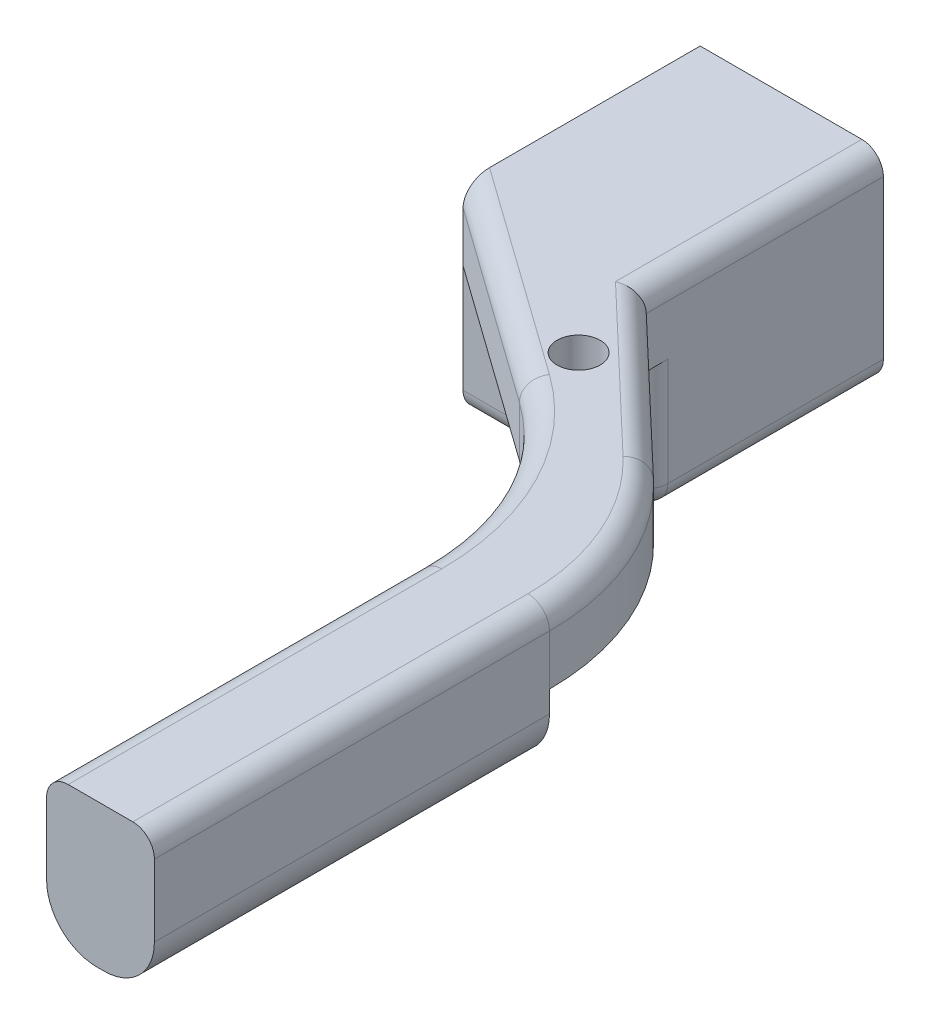
ISO-10303-21;
HEADER;
FILE_DESCRIPTION(('STEP AP214'),'2;1');
FILE_NAME('part.step','',(''),(''),'','','');
FILE_SCHEMA(('AUTOMOTIVE_DESIGN { 1 0 10303 214 1 1 1 1 }'));
ENDSEC;
DATA;
#1=APPLICATION_CONTEXT('core data for automotive mechanical design processes');
#2=APPLICATION_PROTOCOL_DEFINITION('international standard','automotive_design',2000,#1);
#3=PRODUCT_CONTEXT('',#1,'mechanical');
#4=PRODUCT('Part','Part','',(#3));
#5=PRODUCT_RELATED_PRODUCT_CATEGORY('part','',(#4));
#6=PRODUCT_DEFINITION_FORMATION('','',#4);
#7=PRODUCT_DEFINITION_CONTEXT('part definition',#1,'design');
#8=PRODUCT_DEFINITION('design','',#6,#7);
#9=PRODUCT_DEFINITION_SHAPE('','',#8);
#10=(LENGTH_UNIT() NAMED_UNIT(*) SI_UNIT(.MILLI.,.METRE.));
#11=(NAMED_UNIT(*) PLANE_ANGLE_UNIT() SI_UNIT($,.RADIAN.));
#12=(NAMED_UNIT(*) SI_UNIT($,.STERADIAN.) SOLID_ANGLE_UNIT());
#13=UNCERTAINTY_MEASURE_WITH_UNIT(LENGTH_MEASURE(1.E-05),#10,'distance_accuracy_value','');
#14=(GEOMETRIC_REPRESENTATION_CONTEXT(3) GLOBAL_UNCERTAINTY_ASSIGNED_CONTEXT((#13)) GLOBAL_UNIT_ASSIGNED_CONTEXT((#10,
#11,#12)) REPRESENTATION_CONTEXT('',''));
#15=CARTESIAN_POINT('',(0.,0.,0.));
#16=DIRECTION('',(0.,0.,1.));
#17=DIRECTION('',(1.,0.,0.));
#18=AXIS2_PLACEMENT_3D('',#15,#16,#17);
#19=CARTESIAN_POINT('',(0.,0.,0.));
#20=DIRECTION('',(0.,0.,-1.));
#21=DIRECTION('',(-1.,0.,0.));
#22=AXIS2_PLACEMENT_3D('',#19,#20,#21);
#23=PLANE('',#22);
#24=DIRECTION('',(0.,1.,0.));
#25=VECTOR('',#24,1.);
#26=CARTESIAN_POINT('',(9.25,-14.,0.));
#27=LINE('',#26,#25);
#28=CARTESIAN_POINT('',(9.25,-11.,0.));
#29=VERTEX_POINT('',#28);
#30=CARTESIAN_POINT('',(9.25,11.,0.));
#31=VERTEX_POINT('',#30);
#32=EDGE_CURVE('E343',#29,#31,#27,.T.);
#33=ORIENTED_EDGE('',*,*,#32,.F.);
#34=CARTESIAN_POINT('',(6.25,-11.,0.));
#35=DIRECTION('',(0.,0.,-1.));
#36=DIRECTION('',(-1.,0.,0.));
#37=AXIS2_PLACEMENT_3D('',#34,#35,#36);
#38=CIRCLE('',#37,3.);
#39=CARTESIAN_POINT('',(6.25,-14.,0.));
#40=VERTEX_POINT('',#39);
#41=EDGE_CURVE('E652',#29,#40,#38,.T.);
#42=ORIENTED_EDGE('',*,*,#41,.T.);
#43=DIRECTION('',(1.,0.,0.));
#44=VECTOR('',#43,1.);
#45=CARTESIAN_POINT('',(-16.25,-14.,0.));
#46=LINE('',#45,#44);
#47=CARTESIAN_POINT('',(-16.25,-14.,0.));
#48=VERTEX_POINT('',#47);
#49=EDGE_CURVE('E354',#48,#40,#46,.T.);
#50=ORIENTED_EDGE('',*,*,#49,.F.);
#51=DIRECTION('',(0.,-1.,0.));
#52=VECTOR('',#51,1.);
#53=CARTESIAN_POINT('',(-16.25,-14.,0.));
#54=LINE('',#53,#52);
#55=CARTESIAN_POINT('',(-16.25,14.,0.));
#56=VERTEX_POINT('',#55);
#57=EDGE_CURVE('E350',#56,#48,#54,.T.);
#58=ORIENTED_EDGE('',*,*,#57,.F.);
#59=DIRECTION('',(-1.,0.,0.));
#60=VECTOR('',#59,1.);
#61=CARTESIAN_POINT('',(-16.25,14.,0.));
#62=LINE('',#61,#60);
#63=CARTESIAN_POINT('',(6.25,14.,0.));
#64=VERTEX_POINT('',#63);
#65=EDGE_CURVE('E347',#64,#56,#62,.T.);
#66=ORIENTED_EDGE('',*,*,#65,.F.);
#67=CARTESIAN_POINT('',(6.25,11.,0.));
#68=DIRECTION('',(0.,0.,-1.));
#69=DIRECTION('',(-1.,0.,0.));
#70=AXIS2_PLACEMENT_3D('',#67,#68,#69);
#71=CIRCLE('',#70,3.);
#72=EDGE_CURVE('E613',#64,#31,#71,.T.);
#73=ORIENTED_EDGE('',*,*,#72,.T.);
#74=EDGE_LOOP('',(#33,#42,#50,#58,#66,#73));
#75=FACE_BOUND('',#74,.T.);
#76=DIRECTION('',(1.,0.,0.));
#77=VECTOR('',#76,1.);
#78=CARTESIAN_POINT('',(-6.25,-11.3,0.));
#79=LINE('',#78,#77);
#80=CARTESIAN_POINT('',(-6.25,-11.3,0.));
#81=VERTEX_POINT('',#80);
#82=CARTESIAN_POINT('',(6.25,-11.3,0.));
#83=VERTEX_POINT('',#82);
#84=EDGE_CURVE('E303',#81,#83,#79,.T.);
#85=ORIENTED_EDGE('',*,*,#84,.T.);
#86=DIRECTION('',(0.,1.,0.));
#87=VECTOR('',#86,1.);
#88=CARTESIAN_POINT('',(6.25,-11.3,0.));
#89=LINE('',#88,#87);
#90=CARTESIAN_POINT('',(6.25,11.3,0.));
#91=VERTEX_POINT('',#90);
#92=EDGE_CURVE('E230',#83,#91,#89,.T.);
#93=ORIENTED_EDGE('',*,*,#92,.T.);
#94=DIRECTION('',(-1.,0.,0.));
#95=VECTOR('',#94,1.);
#96=CARTESIAN_POINT('',(-6.25,11.3,0.));
#97=LINE('',#96,#95);
#98=CARTESIAN_POINT('',(-6.25,11.3,0.));
#99=VERTEX_POINT('',#98);
#100=EDGE_CURVE('E319',#91,#99,#97,.T.);
#101=ORIENTED_EDGE('',*,*,#100,.T.);
#102=DIRECTION('',(0.,-1.,0.));
#103=VECTOR('',#102,1.);
#104=CARTESIAN_POINT('',(-6.25,-11.3,0.));
#105=LINE('',#104,#103);
#106=EDGE_CURVE('E323',#99,#81,#105,.T.);
#107=ORIENTED_EDGE('',*,*,#106,.T.);
#108=EDGE_LOOP('',(#85,#93,#101,#107));
#109=FACE_BOUND('',#108,.T.);
#110=ADVANCED_FACE('F38',(#75,#109),#23,.T.);
#111=CARTESIAN_POINT('',(9.25,-14.,30.));
#112=DIRECTION('',(-1.,0.,0.));
#113=DIRECTION('',(0.,0.,1.));
#114=AXIS2_PLACEMENT_3D('',#111,#112,#113);
#115=PLANE('',#114);
#116=DIRECTION('',(0.,1.,0.));
#117=VECTOR('',#116,1.);
#118=CARTESIAN_POINT('',(9.25,-6.,33.));
#119=LINE('',#118,#117);
#120=CARTESIAN_POINT('',(9.25,4.,33.));
#121=VERTEX_POINT('',#120);
#122=CARTESIAN_POINT('',(9.25,11.,33.));
#123=VERTEX_POINT('',#122);
#124=EDGE_CURVE('E243',#121,#123,#119,.T.);
#125=ORIENTED_EDGE('',*,*,#124,.F.);
#126=DIRECTION('',(0.,0.,-1.));
#127=VECTOR('',#126,1.);
#128=CARTESIAN_POINT('',(9.25,4.,30.));
#129=LINE('',#128,#127);
#130=CARTESIAN_POINT('',(9.25,4.,30.));
#131=VERTEX_POINT('',#130);
#132=EDGE_CURVE('E56',#121,#131,#129,.T.);
#133=ORIENTED_EDGE('',*,*,#132,.T.);
#134=DIRECTION('',(0.,1.,0.));
#135=VECTOR('',#134,1.);
#136=CARTESIAN_POINT('',(9.25,-14.,30.));
#137=LINE('',#136,#135);
#138=CARTESIAN_POINT('',(9.25,-11.,30.));
#139=VERTEX_POINT('',#138);
#140=EDGE_CURVE('E643',#131,#139,#137,.F.);
#141=ORIENTED_EDGE('',*,*,#140,.T.);
#142=DIRECTION('',(0.,0.,-1.));
#143=VECTOR('',#142,1.);
#144=CARTESIAN_POINT('',(9.25,-11.,30.));
#145=LINE('',#144,#143);
#146=EDGE_CURVE('E635',#139,#29,#145,.T.);
#147=ORIENTED_EDGE('',*,*,#146,.T.);
#148=ORIENTED_EDGE('',*,*,#32,.T.);
#149=DIRECTION('',(0.,0.,-1.));
#150=VECTOR('',#149,1.);
#151=CARTESIAN_POINT('',(9.25,11.,30.));
#152=LINE('',#151,#150);
#153=EDGE_CURVE('E630',#31,#123,#152,.F.);
#154=ORIENTED_EDGE('',*,*,#153,.T.);
#155=EDGE_LOOP('',(#125,#133,#141,#147,#148,#154));
#156=FACE_BOUND('',#155,.T.);
#157=ADVANCED_FACE('F542',(#156),#115,.F.);
#158=CARTESIAN_POINT('',(-16.25,14.,30.));
#159=DIRECTION('',(0.,-1.,0.));
#160=DIRECTION('',(0.,0.,-1.));
#161=AXIS2_PLACEMENT_3D('',#158,#159,#160);
#162=PLANE('',#161);
#163=CARTESIAN_POINT('',(12.25,14.,45.4260665059655));
#164=DIRECTION('',(0.,1.,0.));
#165=DIRECTION('',(0.,0.,1.));
#166=AXIS2_PLACEMENT_3D('',#163,#164,#165);
#167=CIRCLE('',#166,3.);
#168=CARTESIAN_POINT('',(12.25,14.,48.4260665059655));
#169=VERTEX_POINT('',#168);
#170=EDGE_CURVE('E277',#169,#169,#167,.T.);
#171=ORIENTED_EDGE('',*,*,#170,.F.);
#172=EDGE_LOOP('',(#171));
#173=FACE_BOUND('',#172,.T.);
#174=DIRECTION('',(-0.724515403936476,0.,-0.689258608548899));
#175=VECTOR('',#174,1.);
#176=CARTESIAN_POINT('',(7.18222417435331,14.,35.1735462118094));
#177=LINE('',#176,#175);
#178=CARTESIAN_POINT('',(27.8408284679105,14.,54.8268493335579));
#179=VERTEX_POINT('',#178);
#180=CARTESIAN_POINT('',(6.25,14.,34.2866864793879));
#181=VERTEX_POINT('',#180);
#182=EDGE_CURVE('E64',#179,#181,#177,.T.);
#183=ORIENTED_EDGE('',*,*,#182,.T.);
#184=DIRECTION('',(0.,0.,-1.));
#185=VECTOR('',#184,1.);
#186=CARTESIAN_POINT('',(6.25,14.,30.));
#187=LINE('',#186,#185);
#188=EDGE_CURVE('E610',#181,#64,#187,.T.);
#189=ORIENTED_EDGE('',*,*,#188,.T.);
#190=ORIENTED_EDGE('',*,*,#65,.T.);
#191=DIRECTION('',(0.,0.,-1.));
#192=VECTOR('',#191,1.);
#193=CARTESIAN_POINT('',(-16.25,14.,30.));
#194=LINE('',#193,#192);
#195=CARTESIAN_POINT('',(-16.25,14.,29.3143127196483));
#196=VERTEX_POINT('',#195);
#197=EDGE_CURVE('E361',#196,#56,#194,.T.);
#198=ORIENTED_EDGE('',*,*,#197,.F.);
#199=DIRECTION('',(0.813959452282594,0.,0.580921690109622));
#200=VECTOR('',#199,1.);
#201=CARTESIAN_POINT('',(12.8595772185114,14.,50.0897761026611));
#202=LINE('',#201,#200);
#203=CARTESIAN_POINT('',(12.8595772185114,14.,50.0897761026611));
#204=VERTEX_POINT('',#203);
#205=EDGE_CURVE('E400',#196,#204,#202,.T.);
#206=ORIENTED_EDGE('',*,*,#205,.T.);
#207=CARTESIAN_POINT('',(-9.21544700565424,14.,81.0202352893997));
#208=DIRECTION('',(0.,-1.,0.));
#209=DIRECTION('',(0.,0.,-1.));
#210=AXIS2_PLACEMENT_3D('',#207,#208,#209);
#211=CIRCLE('',#210,38.);
#212=CARTESIAN_POINT('',(28.7845529943458,14.,81.0202352893997));
#213=VERTEX_POINT('',#212);
#214=EDGE_CURVE('E397',#204,#213,#211,.T.);
#215=ORIENTED_EDGE('',*,*,#214,.T.);
#216=DIRECTION('',(0.,0.,1.));
#217=VECTOR('',#216,1.);
#218=CARTESIAN_POINT('',(28.7845529943458,14.,133.));
#219=LINE('',#218,#217);
#220=CARTESIAN_POINT('',(28.7845529943458,14.,133.));
#221=VERTEX_POINT('',#220);
#222=EDGE_CURVE('E394',#213,#221,#219,.T.);
#223=ORIENTED_EDGE('',*,*,#222,.T.);
#224=DIRECTION('',(1.,0.,0.));
#225=VECTOR('',#224,1.);
#226=CARTESIAN_POINT('',(25.7845529943458,14.,133.));
#227=LINE('',#226,#225);
#228=CARTESIAN_POINT('',(37.7845529943458,14.,133.));
#229=VERTEX_POINT('',#228);
#230=EDGE_CURVE('E281',#221,#229,#227,.T.);
#231=ORIENTED_EDGE('',*,*,#230,.T.);
#232=DIRECTION('',(0.,0.,-1.));
#233=VECTOR('',#232,1.);
#234=CARTESIAN_POINT('',(37.7845529943458,14.,78.0113422595251));
#235=LINE('',#234,#233);
#236=CARTESIAN_POINT('',(37.7845529943458,14.,78.0113422595251));
#237=VERTEX_POINT('',#236);
#238=EDGE_CURVE('E419',#229,#237,#235,.T.);
#239=ORIENTED_EDGE('',*,*,#238,.T.);
#240=CARTESIAN_POINT('',(5.78455299434576,14.,78.0113422595251));
#241=DIRECTION('',(0.,-1.,0.));
#242=DIRECTION('',(0.,0.,-1.));
#243=AXIS2_PLACEMENT_3D('',#240,#241,#242);
#244=CIRCLE('',#243,32.);
#245=EDGE_CURVE('E429',#237,#179,#244,.F.);
#246=ORIENTED_EDGE('',*,*,#245,.T.);
#247=EDGE_LOOP('',(#183,#189,#190,#198,#206,#215,#223,#231,#239,#246));
#248=FACE_BOUND('',#247,.T.);
#249=ADVANCED_FACE('F549',(#173,#248),#162,.F.);
#250=CARTESIAN_POINT('',(-16.25,-14.,30.));
#251=DIRECTION('',(1.,0.,0.));
#252=DIRECTION('',(0.,0.,-1.));
#253=AXIS2_PLACEMENT_3D('',#250,#251,#252);
#254=PLANE('',#253);
#255=DIRECTION('',(0.,-1.,0.));
#256=VECTOR('',#255,1.);
#257=CARTESIAN_POINT('',(-16.25,14.,33.));
#258=LINE('',#257,#256);
#259=CARTESIAN_POINT('',(-16.25,11.,33.));
#260=VERTEX_POINT('',#259);
#261=CARTESIAN_POINT('',(-16.25,4.,33.));
#262=VERTEX_POINT('',#261);
#263=EDGE_CURVE('E218',#260,#262,#258,.T.);
#264=ORIENTED_EDGE('',*,*,#263,.F.);
#265=CARTESIAN_POINT('',(-16.25,11.,29.3143127196483));
#266=DIRECTION('',(1.,0.,0.));
#267=DIRECTION('',(0.,0.,-1.));
#268=AXIS2_PLACEMENT_3D('',#265,#266,#267);
#269=ELLIPSE('',#268,3.68568728035171,3.);
#270=EDGE_CURVE('E406',#260,#196,#269,.F.);
#271=ORIENTED_EDGE('',*,*,#270,.T.);
#272=ORIENTED_EDGE('',*,*,#197,.T.);
#273=ORIENTED_EDGE('',*,*,#57,.T.);
#274=DIRECTION('',(0.,0.,-1.));
#275=VECTOR('',#274,1.);
#276=CARTESIAN_POINT('',(-16.25,-14.,30.));
#277=LINE('',#276,#275);
#278=CARTESIAN_POINT('',(-16.25,-14.,30.));
#279=VERTEX_POINT('',#278);
#280=EDGE_CURVE('E358',#279,#48,#277,.T.);
#281=ORIENTED_EDGE('',*,*,#280,.F.);
#282=CARTESIAN_POINT('',(-16.25,-11.,30.));
#283=DIRECTION('',(1.,0.,0.));
#284=DIRECTION('',(0.,0.,-1.));
#285=AXIS2_PLACEMENT_3D('',#282,#283,#284);
#286=CIRCLE('',#285,3.);
#287=CARTESIAN_POINT('',(-16.25,-11.,33.));
#288=VERTEX_POINT('',#287);
#289=EDGE_CURVE('E237',#279,#288,#286,.F.);
#290=ORIENTED_EDGE('',*,*,#289,.T.);
#291=EDGE_CURVE('E231',#262,#288,#258,.T.);
#292=ORIENTED_EDGE('',*,*,#291,.F.);
#293=EDGE_LOOP('',(#264,#271,#272,#273,#281,#290,#292));
#294=FACE_BOUND('',#293,.T.);
#295=ADVANCED_FACE('F234',(#294),#254,.F.);
#296=CARTESIAN_POINT('',(-16.25,-14.,30.));
#297=DIRECTION('',(0.,1.,0.));
#298=DIRECTION('',(0.,0.,1.));
#299=AXIS2_PLACEMENT_3D('',#296,#297,#298);
#300=PLANE('',#299);
#301=ORIENTED_EDGE('',*,*,#49,.T.);
#302=DIRECTION('',(0.,0.,-1.));
#303=VECTOR('',#302,1.);
#304=CARTESIAN_POINT('',(6.25,-14.,30.));
#305=LINE('',#304,#303);
#306=CARTESIAN_POINT('',(6.25,-14.,30.));
#307=VERTEX_POINT('',#306);
#308=EDGE_CURVE('E655',#40,#307,#305,.F.);
#309=ORIENTED_EDGE('',*,*,#308,.T.);
#310=DIRECTION('',(1.,0.,0.));
#311=VECTOR('',#310,1.);
#312=CARTESIAN_POINT('',(-16.25,-14.,30.));
#313=LINE('',#312,#311);
#314=EDGE_CURVE('E368',#307,#279,#313,.F.);
#315=ORIENTED_EDGE('',*,*,#314,.T.);
#316=ORIENTED_EDGE('',*,*,#280,.T.);
#317=EDGE_LOOP('',(#301,#309,#315,#316));
#318=FACE_BOUND('',#317,.T.);
#319=ADVANCED_FACE('F538',(#318),#300,.F.);
#320=CARTESIAN_POINT('',(6.25,-11.3,30.));
#321=DIRECTION('',(-1.,0.,0.));
#322=DIRECTION('',(0.,0.,1.));
#323=AXIS2_PLACEMENT_3D('',#320,#321,#322);
#324=PLANE('',#323);
#325=ORIENTED_EDGE('',*,*,#92,.F.);
#326=DIRECTION('',(0.,0.,-1.));
#327=VECTOR('',#326,1.);
#328=CARTESIAN_POINT('',(6.25,-11.3,30.));
#329=LINE('',#328,#327);
#330=CARTESIAN_POINT('',(6.25,-11.3,30.));
#331=VERTEX_POINT('',#330);
#332=EDGE_CURVE('E315',#331,#83,#329,.T.);
#333=ORIENTED_EDGE('',*,*,#332,.F.);
#334=DIRECTION('',(0.,1.,0.));
#335=VECTOR('',#334,1.);
#336=CARTESIAN_POINT('',(6.25,-11.3,30.));
#337=LINE('',#336,#335);
#338=CARTESIAN_POINT('',(6.25,11.3,30.));
#339=VERTEX_POINT('',#338);
#340=EDGE_CURVE('E298',#331,#339,#337,.T.);
#341=ORIENTED_EDGE('',*,*,#340,.T.);
#342=DIRECTION('',(0.,0.,-1.));
#343=VECTOR('',#342,1.);
#344=CARTESIAN_POINT('',(6.25,11.3,30.));
#345=LINE('',#344,#343);
#346=EDGE_CURVE('E339',#339,#91,#345,.T.);
#347=ORIENTED_EDGE('',*,*,#346,.T.);
#348=EDGE_LOOP('',(#325,#333,#341,#347));
#349=FACE_BOUND('',#348,.T.);
#350=ADVANCED_FACE('F534',(#349),#324,.T.);
#351=CARTESIAN_POINT('',(-6.25,11.3,30.));
#352=DIRECTION('',(0.,-1.,0.));
#353=DIRECTION('',(0.,0.,-1.));
#354=AXIS2_PLACEMENT_3D('',#351,#352,#353);
#355=PLANE('',#354);
#356=ORIENTED_EDGE('',*,*,#100,.F.);
#357=ORIENTED_EDGE('',*,*,#346,.F.);
#358=DIRECTION('',(-1.,0.,0.));
#359=VECTOR('',#358,1.);
#360=CARTESIAN_POINT('',(-6.25,11.3,30.));
#361=LINE('',#360,#359);
#362=CARTESIAN_POINT('',(-6.25,11.3,30.));
#363=VERTEX_POINT('',#362);
#364=EDGE_CURVE('E302',#339,#363,#361,.T.);
#365=ORIENTED_EDGE('',*,*,#364,.T.);
#366=DIRECTION('',(0.,0.,-1.));
#367=VECTOR('',#366,1.);
#368=CARTESIAN_POINT('',(-6.25,11.3,30.));
#369=LINE('',#368,#367);
#370=EDGE_CURVE('E336',#363,#99,#369,.T.);
#371=ORIENTED_EDGE('',*,*,#370,.T.);
#372=EDGE_LOOP('',(#356,#357,#365,#371));
#373=FACE_BOUND('',#372,.T.);
#374=ADVANCED_FACE('F530',(#373),#355,.T.);
#375=CARTESIAN_POINT('',(-6.25,-11.3,30.));
#376=DIRECTION('',(1.,0.,0.));
#377=DIRECTION('',(0.,0.,-1.));
#378=AXIS2_PLACEMENT_3D('',#375,#376,#377);
#379=PLANE('',#378);
#380=ORIENTED_EDGE('',*,*,#106,.F.);
#381=ORIENTED_EDGE('',*,*,#370,.F.);
#382=DIRECTION('',(0.,-1.,0.));
#383=VECTOR('',#382,1.);
#384=CARTESIAN_POINT('',(-6.25,-11.3,30.));
#385=LINE('',#384,#383);
#386=CARTESIAN_POINT('',(-6.25,-11.3,30.));
#387=VERTEX_POINT('',#386);
#388=EDGE_CURVE('E307',#363,#387,#385,.T.);
#389=ORIENTED_EDGE('',*,*,#388,.T.);
#390=DIRECTION('',(0.,0.,-1.));
#391=VECTOR('',#390,1.);
#392=CARTESIAN_POINT('',(-6.25,-11.3,30.));
#393=LINE('',#392,#391);
#394=EDGE_CURVE('E333',#387,#81,#393,.T.);
#395=ORIENTED_EDGE('',*,*,#394,.T.);
#396=EDGE_LOOP('',(#380,#381,#389,#395));
#397=FACE_BOUND('',#396,.T.);
#398=ADVANCED_FACE('F526',(#397),#379,.T.);
#399=CARTESIAN_POINT('',(-6.25,-11.3,30.));
#400=DIRECTION('',(0.,1.,0.));
#401=DIRECTION('',(0.,0.,1.));
#402=AXIS2_PLACEMENT_3D('',#399,#400,#401);
#403=PLANE('',#402);
#404=ORIENTED_EDGE('',*,*,#84,.F.);
#405=ORIENTED_EDGE('',*,*,#394,.F.);
#406=DIRECTION('',(1.,0.,0.));
#407=VECTOR('',#406,1.);
#408=CARTESIAN_POINT('',(-6.25,-11.3,30.));
#409=LINE('',#408,#407);
#410=EDGE_CURVE('E311',#387,#331,#409,.T.);
#411=ORIENTED_EDGE('',*,*,#410,.T.);
#412=ORIENTED_EDGE('',*,*,#332,.T.);
#413=EDGE_LOOP('',(#404,#405,#411,#412));
#414=FACE_BOUND('',#413,.T.);
#415=ADVANCED_FACE('F522',(#414),#403,.T.);
#416=CARTESIAN_POINT('',(0.,0.,30.));
#417=DIRECTION('',(0.,0.,-1.));
#418=DIRECTION('',(-1.,0.,0.));
#419=AXIS2_PLACEMENT_3D('',#416,#417,#418);
#420=PLANE('',#419);
#421=ORIENTED_EDGE('',*,*,#340,.F.);
#422=ORIENTED_EDGE('',*,*,#410,.F.);
#423=ORIENTED_EDGE('',*,*,#388,.F.);
#424=ORIENTED_EDGE('',*,*,#364,.F.);
#425=EDGE_LOOP('',(#421,#422,#423,#424));
#426=FACE_BOUND('',#425,.T.);
#427=ADVANCED_FACE('F519',(#426),#420,.T.);
#428=CARTESIAN_POINT('',(0.,0.,33.));
#429=DIRECTION('',(0.,0.,-1.));
#430=DIRECTION('',(-1.,0.,0.));
#431=AXIS2_PLACEMENT_3D('',#428,#429,#430);
#432=PLANE('',#431);
#433=DIRECTION('',(1.,0.,0.));
#434=VECTOR('',#433,1.);
#435=CARTESIAN_POINT('',(0.,-11.,33.));
#436=LINE('',#435,#434);
#437=CARTESIAN_POINT('',(6.25,-11.,33.));
#438=VERTEX_POINT('',#437);
#439=EDGE_CURVE('E365',#288,#438,#436,.T.);
#440=ORIENTED_EDGE('',*,*,#439,.T.);
#441=DIRECTION('',(0.,1.,0.));
#442=VECTOR('',#441,1.);
#443=CARTESIAN_POINT('',(6.25,0.,33.));
#444=LINE('',#443,#442);
#445=CARTESIAN_POINT('',(6.25,4.,33.));
#446=VERTEX_POINT('',#445);
#447=EDGE_CURVE('E256',#438,#446,#444,.T.);
#448=ORIENTED_EDGE('',*,*,#447,.T.);
#449=DIRECTION('',(1.,0.,0.));
#450=VECTOR('',#449,1.);
#451=CARTESIAN_POINT('',(-16.25,4.,33.));
#452=LINE('',#451,#450);
#453=EDGE_CURVE('E247',#262,#446,#452,.T.);
#454=ORIENTED_EDGE('',*,*,#453,.F.);
#455=ORIENTED_EDGE('',*,*,#291,.T.);
#456=EDGE_LOOP('',(#440,#448,#454,#455));
#457=FACE_BOUND('',#456,.T.);
#458=ADVANCED_FACE('F254',(#457),#432,.F.);
#459=CARTESIAN_POINT('',(9.25,-6.,33.));
#460=DIRECTION('',(0.689258608548899,0.,-0.724515403936476));
#461=DIRECTION('',(-0.724515403936476,0.,-0.689258608548899));
#462=AXIS2_PLACEMENT_3D('',#459,#460,#461);
#463=PLANE('',#462);
#464=ORIENTED_EDGE('',*,*,#124,.T.);
#465=DIRECTION('',(-0.724515403936476,0.,-0.689258608548899));
#466=VECTOR('',#465,1.);
#467=CARTESIAN_POINT('',(29.9086042935573,11.,52.6533031217484));
#468=LINE('',#467,#466);
#469=CARTESIAN_POINT('',(29.9086042935572,11.,52.6533031217484));
#470=VERTEX_POINT('',#469);
#471=EDGE_CURVE('E434',#123,#470,#468,.F.);
#472=ORIENTED_EDGE('',*,*,#471,.T.);
#473=DIRECTION('',(0.,1.,0.));
#474=VECTOR('',#473,1.);
#475=CARTESIAN_POINT('',(29.9086042935572,-6.,52.6533031217484));
#476=LINE('',#475,#474);
#477=CARTESIAN_POINT('',(29.9086042935572,4.,52.6533031217485));
#478=VERTEX_POINT('',#477);
#479=EDGE_CURVE('E377',#470,#478,#476,.F.);
#480=ORIENTED_EDGE('',*,*,#479,.T.);
#481=DIRECTION('',(0.724515403936476,0.,0.689258608548899));
#482=VECTOR('',#481,1.);
#483=CARTESIAN_POINT('',(9.25,4.,33.));
#484=LINE('',#483,#482);
#485=EDGE_CURVE('E274',#121,#478,#484,.T.);
#486=ORIENTED_EDGE('',*,*,#485,.F.);
#487=EDGE_LOOP('',(#464,#472,#480,#486));
#488=FACE_BOUND('',#487,.T.);
#489=ADVANCED_FACE('F499',(#488),#463,.T.);
#490=CARTESIAN_POINT('',(40.7845529943458,-6.,133.));
#491=DIRECTION('',(1.,0.,0.));
#492=DIRECTION('',(0.,0.,-1.));
#493=AXIS2_PLACEMENT_3D('',#490,#491,#492);
#494=PLANE('',#493);
#495=DIRECTION('',(0.,1.,0.));
#496=VECTOR('',#495,1.);
#497=CARTESIAN_POINT('',(40.7845529943458,-6.,133.));
#498=LINE('',#497,#496);
#499=CARTESIAN_POINT('',(40.7845529943458,0.999999999999998,133.));
#500=VERTEX_POINT('',#499);
#501=CARTESIAN_POINT('',(40.7845529943458,11.,133.));
#502=VERTEX_POINT('',#501);
#503=EDGE_CURVE('E293',#500,#502,#498,.T.);
#504=ORIENTED_EDGE('',*,*,#503,.F.);
#505=DIRECTION('',(0.,0.,-1.));
#506=VECTOR('',#505,1.);
#507=CARTESIAN_POINT('',(40.7845529943458,0.999999999999998,78.0113422595251));
#508=LINE('',#507,#506);
#509=CARTESIAN_POINT('',(40.7845529943458,0.999999999999998,78.0113422595251));
#510=VERTEX_POINT('',#509);
#511=EDGE_CURVE('E674',#500,#510,#508,.T.);
#512=ORIENTED_EDGE('',*,*,#511,.T.);
#513=DIRECTION('',(0.,1.,0.));
#514=VECTOR('',#513,1.);
#515=CARTESIAN_POINT('',(40.7845529943458,-6.,78.0113422595251));
#516=LINE('',#515,#514);
#517=CARTESIAN_POINT('',(40.7845529943458,4.,78.0113422595251));
#518=VERTEX_POINT('',#517);
#519=EDGE_CURVE('E374',#510,#518,#516,.T.);
#520=ORIENTED_EDGE('',*,*,#519,.T.);
#521=CARTESIAN_POINT('',(40.7845529943458,11.,78.0113422595251));
#522=VERTEX_POINT('',#521);
#523=EDGE_CURVE('E373',#518,#522,#516,.T.);
#524=ORIENTED_EDGE('',*,*,#523,.T.);
#525=DIRECTION('',(0.,0.,-1.));
#526=VECTOR('',#525,1.);
#527=CARTESIAN_POINT('',(40.7845529943458,11.,133.));
#528=LINE('',#527,#526);
#529=EDGE_CURVE('E440',#522,#502,#528,.F.);
#530=ORIENTED_EDGE('',*,*,#529,.T.);
#531=EDGE_LOOP('',(#504,#512,#520,#524,#530));
#532=FACE_BOUND('',#531,.T.);
#533=ADVANCED_FACE('F502',(#532),#494,.T.);
#534=CARTESIAN_POINT('',(25.7845529943458,-6.,133.));
#535=DIRECTION('',(0.,0.,1.));
#536=DIRECTION('',(1.,0.,0.));
#537=AXIS2_PLACEMENT_3D('',#534,#535,#536);
#538=PLANE('',#537);
#539=DIRECTION('',(1.,0.,0.));
#540=VECTOR('',#539,1.);
#541=CARTESIAN_POINT('',(25.7845529943458,-6.,133.));
#542=LINE('',#541,#540);
#543=CARTESIAN_POINT('',(32.7845529943458,-6.,133.));
#544=VERTEX_POINT('',#543);
#545=CARTESIAN_POINT('',(33.7845529943458,-6.,133.));
#546=VERTEX_POINT('',#545);
#547=EDGE_CURVE('E282',#544,#546,#542,.T.);
#548=ORIENTED_EDGE('',*,*,#547,.T.);
#549=CARTESIAN_POINT('',(33.7845529943458,0.999999999999998,133.));
#550=DIRECTION('',(0.,0.,1.));
#551=DIRECTION('',(1.,0.,0.));
#552=AXIS2_PLACEMENT_3D('',#549,#550,#551);
#553=CIRCLE('',#552,7.);
#554=EDGE_CURVE('E637',#546,#500,#553,.T.);
#555=ORIENTED_EDGE('',*,*,#554,.T.);
#556=ORIENTED_EDGE('',*,*,#503,.T.);
#557=CARTESIAN_POINT('',(37.7845529943458,11.,133.));
#558=DIRECTION('',(0.,0.,1.));
#559=DIRECTION('',(1.,0.,0.));
#560=AXIS2_PLACEMENT_3D('',#557,#558,#559);
#561=CIRCLE('',#560,3.);
#562=EDGE_CURVE('E444',#502,#229,#561,.T.);
#563=ORIENTED_EDGE('',*,*,#562,.T.);
#564=ORIENTED_EDGE('',*,*,#230,.F.);
#565=CARTESIAN_POINT('',(28.7845529943458,11.,133.));
#566=DIRECTION('',(0.,0.,1.));
#567=DIRECTION('',(1.,0.,0.));
#568=AXIS2_PLACEMENT_3D('',#565,#566,#567);
#569=CIRCLE('',#568,3.);
#570=CARTESIAN_POINT('',(25.7845529943458,11.,133.));
#571=VERTEX_POINT('',#570);
#572=EDGE_CURVE('E412',#221,#571,#569,.T.);
#573=ORIENTED_EDGE('',*,*,#572,.T.);
#574=DIRECTION('',(0.,1.,0.));
#575=VECTOR('',#574,1.);
#576=CARTESIAN_POINT('',(25.7845529943458,-6.,133.));
#577=LINE('',#576,#575);
#578=CARTESIAN_POINT('',(25.7845529943458,0.999999999999998,133.));
#579=VERTEX_POINT('',#578);
#580=EDGE_CURVE('E286',#579,#571,#577,.T.);
#581=ORIENTED_EDGE('',*,*,#580,.F.);
#582=CARTESIAN_POINT('',(32.7845529943458,0.999999999999998,133.));
#583=DIRECTION('',(0.,0.,1.));
#584=DIRECTION('',(1.,0.,0.));
#585=AXIS2_PLACEMENT_3D('',#582,#583,#584);
#586=CIRCLE('',#585,7.);
#587=EDGE_CURVE('E677',#579,#544,#586,.T.);
#588=ORIENTED_EDGE('',*,*,#587,.T.);
#589=EDGE_LOOP('',(#548,#555,#556,#563,#564,#573,#581,#588));
#590=FACE_BOUND('',#589,.T.);
#591=ADVANCED_FACE('F506',(#590),#538,.T.);
#592=CARTESIAN_POINT('',(25.7845529943458,-6.,63.));
#593=DIRECTION('',(-1.,0.,0.));
#594=DIRECTION('',(0.,0.,1.));
#595=AXIS2_PLACEMENT_3D('',#592,#593,#594);
#596=PLANE('',#595);
#597=DIRECTION('',(0.,1.,0.));
#598=VECTOR('',#597,1.);
#599=CARTESIAN_POINT('',(25.7845529943458,-6.,81.0202352893997));
#600=LINE('',#599,#598);
#601=CARTESIAN_POINT('',(25.7845529943458,11.,81.0202352893997));
#602=VERTEX_POINT('',#601);
#603=CARTESIAN_POINT('',(25.7845529943458,0.999999999999998,81.0202352893997));
#604=VERTEX_POINT('',#603);
#605=EDGE_CURVE('E383',#602,#604,#600,.F.);
#606=ORIENTED_EDGE('',*,*,#605,.T.);
#607=DIRECTION('',(0.,0.,1.));
#608=VECTOR('',#607,1.);
#609=CARTESIAN_POINT('',(25.7845529943458,0.999999999999998,133.));
#610=LINE('',#609,#608);
#611=EDGE_CURVE('E631',#604,#579,#610,.T.);
#612=ORIENTED_EDGE('',*,*,#611,.T.);
#613=ORIENTED_EDGE('',*,*,#580,.T.);
#614=DIRECTION('',(0.,0.,1.));
#615=VECTOR('',#614,1.);
#616=CARTESIAN_POINT('',(25.7845529943458,11.,81.0202352893997));
#617=LINE('',#616,#615);
#618=EDGE_CURVE('E416',#571,#602,#617,.F.);
#619=ORIENTED_EDGE('',*,*,#618,.T.);
#620=EDGE_LOOP('',(#606,#612,#613,#619));
#621=FACE_BOUND('',#620,.T.);
#622=ADVANCED_FACE('F510',(#621),#596,.T.);
#623=CARTESIAN_POINT('',(-16.25,-6.,33.));
#624=DIRECTION('',(-0.580921690109622,0.,0.813959452282594));
#625=DIRECTION('',(0.813959452282594,0.,0.580921690109622));
#626=AXIS2_PLACEMENT_3D('',#623,#624,#625);
#627=PLANE('',#626);
#628=DIRECTION('',(0.,1.,0.));
#629=VECTOR('',#628,1.);
#630=CARTESIAN_POINT('',(11.1168121481825,14.,52.5316544595089));
#631=LINE('',#630,#629);
#632=CARTESIAN_POINT('',(11.1168121481825,4.,52.5316544595089));
#633=VERTEX_POINT('',#632);
#634=CARTESIAN_POINT('',(11.1168121481825,11.,52.5316544595089));
#635=VERTEX_POINT('',#634);
#636=EDGE_CURVE('E380',#633,#635,#631,.T.);
#637=ORIENTED_EDGE('',*,*,#636,.T.);
#638=DIRECTION('',(0.813959452282594,0.,0.580921690109622));
#639=VECTOR('',#638,1.);
#640=CARTESIAN_POINT('',(-16.25,11.,33.));
#641=LINE('',#640,#639);
#642=EDGE_CURVE('E226',#635,#260,#641,.F.);
#643=ORIENTED_EDGE('',*,*,#642,.T.);
#644=ORIENTED_EDGE('',*,*,#263,.T.);
#645=DIRECTION('',(-0.813959452282594,0.,-0.580921690109622));
#646=VECTOR('',#645,1.);
#647=CARTESIAN_POINT('',(-16.25,4.,33.));
#648=LINE('',#647,#646);
#649=EDGE_CURVE('E223',#633,#262,#648,.T.);
#650=ORIENTED_EDGE('',*,*,#649,.F.);
#651=EDGE_LOOP('',(#637,#643,#644,#650));
#652=FACE_BOUND('',#651,.T.);
#653=ADVANCED_FACE('F221',(#652),#627,.T.);
#654=CARTESIAN_POINT('',(0.,-6.,0.));
#655=DIRECTION('',(0.,1.,0.));
#656=DIRECTION('',(0.,0.,1.));
#657=AXIS2_PLACEMENT_3D('',#654,#655,#656);
#658=PLANE('',#657);
#659=DIRECTION('',(-1.,0.,0.));
#660=VECTOR('',#659,1.);
#661=CARTESIAN_POINT('',(-16.25,-6.,78.0113422595251));
#662=LINE('',#661,#660);
#663=CARTESIAN_POINT('',(33.7845529943458,-6.,78.0113422595251));
#664=VERTEX_POINT('',#663);
#665=CARTESIAN_POINT('',(32.67663533379,-6.,78.0113422595251));
#666=VERTEX_POINT('',#665);
#667=EDGE_CURVE('E259',#664,#666,#662,.T.);
#668=ORIENTED_EDGE('',*,*,#667,.F.);
#669=DIRECTION('',(0.,0.,-1.));
#670=VECTOR('',#669,1.);
#671=CARTESIAN_POINT('',(33.7845529943458,-6.,133.));
#672=LINE('',#671,#670);
#673=EDGE_CURVE('E462',#664,#546,#672,.F.);
#674=ORIENTED_EDGE('',*,*,#673,.T.);
#675=ORIENTED_EDGE('',*,*,#547,.F.);
#676=DIRECTION('',(0.,0.,1.));
#677=VECTOR('',#676,1.);
#678=CARTESIAN_POINT('',(32.7845529943458,-6.,81.0202352893997));
#679=LINE('',#678,#677);
#680=CARTESIAN_POINT('',(32.7845529943458,-6.,81.0202352893997));
#681=VERTEX_POINT('',#680);
#682=EDGE_CURVE('E447',#544,#681,#679,.F.);
#683=ORIENTED_EDGE('',*,*,#682,.T.);
#684=CARTESIAN_POINT('',(-9.21544700565424,-6.,81.0202352893997));
#685=DIRECTION('',(0.,1.,0.));
#686=DIRECTION('',(0.,0.,1.));
#687=AXIS2_PLACEMENT_3D('',#684,#685,#686);
#688=CIRCLE('',#687,42.);
#689=EDGE_CURVE('E458',#681,#666,#688,.T.);
#690=ORIENTED_EDGE('',*,*,#689,.T.);
#691=EDGE_LOOP('',(#668,#674,#675,#683,#690));
#692=FACE_BOUND('',#691,.T.);
#693=ADVANCED_FACE('F494',(#692),#658,.F.);
#694=CARTESIAN_POINT('',(0.,-11.,30.));
#695=DIRECTION('',(1.,0.,0.));
#696=DIRECTION('',(0.,0.,-1.));
#697=AXIS2_PLACEMENT_3D('',#694,#695,#696);
#698=CYLINDRICAL_SURFACE('',#697,3.);
#699=ORIENTED_EDGE('',*,*,#314,.F.);
#700=CARTESIAN_POINT('',(6.25,-11.,30.));
#701=DIRECTION('',(1.,0.,0.));
#702=DIRECTION('',(0.,0.,-1.));
#703=AXIS2_PLACEMENT_3D('',#700,#701,#702);
#704=CIRCLE('',#703,3.);
#705=EDGE_CURVE('E618',#307,#438,#704,.F.);
#706=ORIENTED_EDGE('',*,*,#705,.T.);
#707=ORIENTED_EDGE('',*,*,#439,.F.);
#708=ORIENTED_EDGE('',*,*,#289,.F.);
#709=EDGE_LOOP('',(#699,#706,#707,#708));
#710=FACE_BOUND('',#709,.T.);
#711=ADVANCED_FACE('F497',(#710),#698,.T.);
#712=CARTESIAN_POINT('',(5.78455299434576,-6.,78.0113422595251));
#713=DIRECTION('',(0.,1.,0.));
#714=DIRECTION('',(0.,0.,1.));
#715=AXIS2_PLACEMENT_3D('',#712,#713,#714);
#716=CYLINDRICAL_SURFACE('',#715,35.);
#717=ORIENTED_EDGE('',*,*,#479,.F.);
#718=CARTESIAN_POINT('',(5.78455299434576,11.,78.0113422595251));
#719=DIRECTION('',(0.,-1.,0.));
#720=DIRECTION('',(0.,0.,-1.));
#721=AXIS2_PLACEMENT_3D('',#718,#719,#720);
#722=CIRCLE('',#721,35.);
#723=EDGE_CURVE('E437',#470,#522,#722,.T.);
#724=ORIENTED_EDGE('',*,*,#723,.T.);
#725=ORIENTED_EDGE('',*,*,#523,.F.);
#726=CARTESIAN_POINT('',(5.78455299434576,4.,78.0113422595251));
#727=DIRECTION('',(0.,1.,0.));
#728=DIRECTION('',(0.,0.,1.));
#729=AXIS2_PLACEMENT_3D('',#726,#727,#728);
#730=CIRCLE('',#729,35.);
#731=EDGE_CURVE('E251',#478,#518,#730,.F.);
#732=ORIENTED_EDGE('',*,*,#731,.F.);
#733=EDGE_LOOP('',(#717,#724,#725,#732));
#734=FACE_BOUND('',#733,.T.);
#735=ADVANCED_FACE('F558',(#734),#716,.T.);
#736=CARTESIAN_POINT('',(-9.21544700565424,-6.,81.0202352893997));
#737=DIRECTION('',(0.,-1.,0.));
#738=DIRECTION('',(0.,0.,-1.));
#739=AXIS2_PLACEMENT_3D('',#736,#737,#738);
#740=CYLINDRICAL_SURFACE('',#739,35.);
#741=DIRECTION('',(0.,-1.,0.));
#742=VECTOR('',#741,1.);
#743=CARTESIAN_POINT('',(25.6549783249145,-6.,78.0113422595251));
#744=LINE('',#743,#742);
#745=CARTESIAN_POINT('',(25.6549783249145,4.,78.0113422595251));
#746=VERTEX_POINT('',#745);
#747=CARTESIAN_POINT('',(25.6549783249145,0.999999999999998,78.0113422595251));
#748=VERTEX_POINT('',#747);
#749=EDGE_CURVE('E387',#746,#748,#744,.T.);
#750=ORIENTED_EDGE('',*,*,#749,.T.);
#751=CARTESIAN_POINT('',(-9.21544700565424,0.999999999999998,81.0202352893997));
#752=DIRECTION('',(0.,1.,0.));
#753=DIRECTION('',(0.,0.,1.));
#754=AXIS2_PLACEMENT_3D('',#751,#752,#753);
#755=CIRCLE('',#754,35.);
#756=EDGE_CURVE('E477',#748,#604,#755,.F.);
#757=ORIENTED_EDGE('',*,*,#756,.T.);
#758=ORIENTED_EDGE('',*,*,#605,.F.);
#759=CARTESIAN_POINT('',(-9.21544700565424,11.,81.0202352893997));
#760=DIRECTION('',(0.,-1.,0.));
#761=DIRECTION('',(0.,0.,-1.));
#762=AXIS2_PLACEMENT_3D('',#759,#760,#761);
#763=CIRCLE('',#762,35.);
#764=EDGE_CURVE('E409',#602,#635,#763,.F.);
#765=ORIENTED_EDGE('',*,*,#764,.T.);
#766=ORIENTED_EDGE('',*,*,#636,.F.);
#767=CARTESIAN_POINT('',(-9.21544700565424,4.,81.0202352893997));
#768=DIRECTION('',(0.,1.,0.));
#769=DIRECTION('',(0.,0.,1.));
#770=AXIS2_PLACEMENT_3D('',#767,#768,#769);
#771=CIRCLE('',#770,35.);
#772=EDGE_CURVE('E249',#633,#746,#771,.F.);
#773=ORIENTED_EDGE('',*,*,#772,.T.);
#774=EDGE_LOOP('',(#750,#757,#758,#765,#766,#773));
#775=FACE_BOUND('',#774,.T.);
#776=ADVANCED_FACE('F492',(#775),#740,.F.);
#777=CARTESIAN_POINT('',(12.25,-16.,45.4260665059655));
#778=DIRECTION('',(0.,1.,0.));
#779=DIRECTION('',(0.,0.,1.));
#780=AXIS2_PLACEMENT_3D('',#777,#778,#779);
#781=CYLINDRICAL_SURFACE('',#780,3.);
#782=CARTESIAN_POINT('',(12.25,4.,45.4260665059655));
#783=DIRECTION('',(0.,1.,0.));
#784=DIRECTION('',(0.,0.,1.));
#785=AXIS2_PLACEMENT_3D('',#782,#783,#784);
#786=CIRCLE('',#785,3.);
#787=CARTESIAN_POINT('',(12.25,4.,48.4260665059655));
#788=VERTEX_POINT('',#787);
#789=EDGE_CURVE('E263',#788,#788,#786,.F.);
#790=ORIENTED_EDGE('',*,*,#789,.T.);
#791=EDGE_LOOP('',(#790));
#792=FACE_BOUND('',#791,.T.);
#793=ORIENTED_EDGE('',*,*,#170,.T.);
#794=EDGE_LOOP('',(#793));
#795=FACE_BOUND('',#794,.T.);
#796=ADVANCED_FACE('F488',(#792,#795),#781,.F.);
#797=CARTESIAN_POINT('',(-16.25,4.,78.0113422595251));
#798=DIRECTION('',(0.,0.,1.));
#799=DIRECTION('',(1.,0.,0.));
#800=AXIS2_PLACEMENT_3D('',#797,#798,#799);
#801=PLANE('',#800);
#802=ORIENTED_EDGE('',*,*,#667,.T.);
#803=CARTESIAN_POINT('',(32.67663533379,-6.,78.0113422595251));
#804=CARTESIAN_POINT('',(32.4787515244459,-6.00002092804797,78.0113422595251));
#805=CARTESIAN_POINT('',(32.2808709247693,-5.99165294250571,78.0113422595251));
#806=CARTESIAN_POINT('',(31.8865247317422,-5.95829405192185,78.0113422595251));
#807=CARTESIAN_POINT('',(31.6900590724009,-5.93330392725456,78.0113422595251));
#808=CARTESIAN_POINT('',(31.3000691505453,-5.86687891321132,78.0113422595251));
#809=CARTESIAN_POINT('',(31.1065429239394,-5.82545555595758,78.0113422595251));
#810=CARTESIAN_POINT('',(30.7236672008387,-5.72646415252481,78.0113422595251));
#811=CARTESIAN_POINT('',(30.5343176542781,-5.66889629998348,78.0113422595251));
#812=CARTESIAN_POINT('',(30.1610810145609,-5.5379995132843,78.0113422595251));
#813=CARTESIAN_POINT('',(29.977195629507,-5.46466570845918,78.0113422595251));
#814=CARTESIAN_POINT('',(29.6161913046016,-5.30273458506586,78.0113422595251));
#815=CARTESIAN_POINT('',(29.43907488237,-5.21413165358161,78.0113422595251));
#816=CARTESIAN_POINT('',(29.0930102679669,-5.02234137756442,78.0113422595251));
#817=CARTESIAN_POINT('',(28.9240590081894,-4.91915956830513,78.0113422595251));
#818=CARTESIAN_POINT('',(28.5954580833872,-4.69891091492017,78.0113422595251));
#819=CARTESIAN_POINT('',(28.4358085972892,-4.58184380383143,78.0113422595251));
#820=CARTESIAN_POINT('',(28.1270788365084,-4.33474693073584,78.0113422595251));
#821=CARTESIAN_POINT('',(27.9779905385264,-4.20472719348829,78.0113422595251));
#822=CARTESIAN_POINT('',(27.6913199886436,-3.93256759013443,78.0113422595251));
#823=CARTESIAN_POINT('',(27.5537377369489,-3.79042772381109,78.0113422595251));
#824=CARTESIAN_POINT('',(27.2910453830692,-3.49500330301758,78.0113422595251));
#825=CARTESIAN_POINT('',(27.1659378250066,-3.34171648618675,78.0113422595251));
#826=CARTESIAN_POINT('',(26.9291364317692,-3.02511555566041,78.0113422595251));
#827=CARTESIAN_POINT('',(26.81744227074,-2.8618016856999,78.0113422595251));
#828=CARTESIAN_POINT('',(26.6085223788456,-2.52669869698297,78.0113422595251));
#829=CARTESIAN_POINT('',(26.5112633748365,-2.3549303235063,78.0113422595251));
#830=CARTESIAN_POINT('',(26.3316429918547,-2.00385477001934,78.0113422595251));
#831=CARTESIAN_POINT('',(26.249276128659,-1.82455039534207,78.0113422595251));
#832=CARTESIAN_POINT('',(26.100020955125,-1.45967200757722,78.0113422595251));
#833=CARTESIAN_POINT('',(26.03312759184,-1.2741000639449,78.0113422595251));
#834=CARTESIAN_POINT('',(25.9152919647572,-0.898036825562483,78.0113422595251));
#835=CARTESIAN_POINT('',(25.8643457171796,-0.707546772306904,78.0113422595251));
#836=CARTESIAN_POINT('',(25.7662200943628,-0.266546514166106,78.0113422595251));
#837=CARTESIAN_POINT('',(25.7245065376659,-0.0147860555644746,78.0113422595251));
#838=CARTESIAN_POINT('',(25.682794867754,0.364831594271835,78.0113422595251));
#839=CARTESIAN_POINT('',(25.6723674316635,0.491635653424437,78.0113422595251));
#840=CARTESIAN_POINT('',(25.6584599197326,0.745616373921531,78.0113422595251));
#841=CARTESIAN_POINT('',(25.6549794149575,0.872793011775726,78.0113422595251));
#842=CARTESIAN_POINT('',(25.6549783249145,0.999999999999997,78.0113422595251));
#843=B_SPLINE_CURVE_WITH_KNOTS('',3,(#803,#804,#805,#806,#807,#808,#809,#810,#811,#812,#813,
#814,#815,#816,#817,#818,#819,#820,#821,#822,#823,#824,#825,#826,#827,#828,#829,#830,#831,#832,
#833,#834,#835,#836,#837,#838,#839,#840,#841,#842),.UNSPECIFIED.,.F.,.F.,(4,2,2,2,2,2,2,2,2,2,2,
2,2,2,2,2,2,2,2,4),(0.,0.59347006614478,1.18691227209057,1.77993876090097,2.37295813723313,
2.96616098242744,3.55958235537276,4.15277902193885,4.74598709533566,5.33873956712969,
5.93149204953768,6.52436517327249,7.11722389130264,7.70869410365011,8.29994605382381,
8.89100465436549,9.48191548335844,10.2457599165363,10.6272962782329,11.0088090814345),.UNSPECIFIED.);
#844=EDGE_CURVE('E468',#666,#748,#843,.T.);
#845=ORIENTED_EDGE('',*,*,#844,.T.);
#846=ORIENTED_EDGE('',*,*,#749,.F.);
#847=DIRECTION('',(-1.,0.,0.));
#848=VECTOR('',#847,1.);
#849=CARTESIAN_POINT('',(-16.25,4.,78.0113422595251));
#850=LINE('',#849,#848);
#851=EDGE_CURVE('E258',#518,#746,#850,.T.);
#852=ORIENTED_EDGE('',*,*,#851,.F.);
#853=ORIENTED_EDGE('',*,*,#519,.F.);
#854=CARTESIAN_POINT('',(33.7845529943458,0.999999999999998,78.0113422595251));
#855=DIRECTION('',(0.,0.,1.));
#856=DIRECTION('',(1.,0.,0.));
#857=AXIS2_PLACEMENT_3D('',#854,#855,#856);
#858=CIRCLE('',#857,7.);
#859=EDGE_CURVE('E465',#510,#664,#858,.F.);
#860=ORIENTED_EDGE('',*,*,#859,.T.);
#861=EDGE_LOOP('',(#802,#845,#846,#852,#853,#860));
#862=FACE_BOUND('',#861,.T.);
#863=ADVANCED_FACE('F483',(#862),#801,.F.);
#864=CARTESIAN_POINT('',(0.,4.,0.));
#865=DIRECTION('',(0.,1.,0.));
#866=DIRECTION('',(0.,0.,1.));
#867=AXIS2_PLACEMENT_3D('',#864,#865,#866);
#868=PLANE('',#867);
#869=ORIENTED_EDGE('',*,*,#485,.T.);
#870=ORIENTED_EDGE('',*,*,#731,.T.);
#871=ORIENTED_EDGE('',*,*,#851,.T.);
#872=ORIENTED_EDGE('',*,*,#772,.F.);
#873=ORIENTED_EDGE('',*,*,#649,.T.);
#874=ORIENTED_EDGE('',*,*,#453,.T.);
#875=CARTESIAN_POINT('',(6.25,4.,30.));
#876=DIRECTION('',(0.,1.,0.));
#877=DIRECTION('',(0.,0.,1.));
#878=AXIS2_PLACEMENT_3D('',#875,#876,#877);
#879=CIRCLE('',#878,3.);
#880=EDGE_CURVE('E48',#446,#131,#879,.T.);
#881=ORIENTED_EDGE('',*,*,#880,.T.);
#882=ORIENTED_EDGE('',*,*,#132,.F.);
#883=EDGE_LOOP('',(#869,#870,#871,#872,#873,#874,#881,#882));
#884=FACE_BOUND('',#883,.T.);
#885=ORIENTED_EDGE('',*,*,#789,.F.);
#886=EDGE_LOOP('',(#885));
#887=FACE_BOUND('',#886,.T.);
#888=ADVANCED_FACE('F245',(#884,#887),#868,.F.);
#889=CARTESIAN_POINT('',(28.7845529943458,11.,30.));
#890=DIRECTION('',(0.,0.,-1.));
#891=DIRECTION('',(-1.,0.,0.));
#892=AXIS2_PLACEMENT_3D('',#889,#890,#891);
#893=CYLINDRICAL_SURFACE('',#892,3.);
#894=ORIENTED_EDGE('',*,*,#572,.F.);
#895=ORIENTED_EDGE('',*,*,#222,.F.);
#896=CARTESIAN_POINT('',(28.7845529943458,11.,81.0202352893997));
#897=DIRECTION('',(0.,0.,-1.));
#898=DIRECTION('',(-1.,0.,0.));
#899=AXIS2_PLACEMENT_3D('',#896,#897,#898);
#900=CIRCLE('',#899,3.);
#901=EDGE_CURVE('E266',#602,#213,#900,.T.);
#902=ORIENTED_EDGE('',*,*,#901,.F.);
#903=ORIENTED_EDGE('',*,*,#618,.F.);
#904=EDGE_LOOP('',(#894,#895,#902,#903));
#905=FACE_BOUND('',#904,.T.);
#906=ADVANCED_FACE('F574',(#905),#893,.T.);
#907=CARTESIAN_POINT('',(-9.21544700565424,11.,81.0202352893997));
#908=DIRECTION('',(0.,-1.,0.));
#909=DIRECTION('',(0.,0.,-1.));
#910=AXIS2_PLACEMENT_3D('',#907,#908,#909);
#911=TOROIDAL_SURFACE('',#910,38.,3.);
#912=ORIENTED_EDGE('',*,*,#901,.T.);
#913=ORIENTED_EDGE('',*,*,#214,.F.);
#914=CARTESIAN_POINT('',(12.8595772185114,11.,50.0897761026611));
#915=DIRECTION('',(-0.813959452282594,0.,-0.580921690109622));
#916=DIRECTION('',(-0.580921690109622,0.,0.813959452282594));
#917=AXIS2_PLACEMENT_3D('',#914,#915,#916);
#918=CIRCLE('',#917,3.);
#919=EDGE_CURVE('E420',#635,#204,#918,.T.);
#920=ORIENTED_EDGE('',*,*,#919,.F.);
#921=ORIENTED_EDGE('',*,*,#764,.F.);
#922=EDGE_LOOP('',(#912,#913,#920,#921));
#923=FACE_BOUND('',#922,.T.);
#924=ADVANCED_FACE('F570',(#923),#911,.T.);
#925=CARTESIAN_POINT('',(-15.9257750317733,11.,29.5457116130328));
#926=DIRECTION('',(-0.813959452282594,0.,-0.580921690109622));
#927=DIRECTION('',(-0.580921690109622,0.,0.813959452282594));
#928=AXIS2_PLACEMENT_3D('',#925,#926,#927);
#929=CYLINDRICAL_SURFACE('',#928,3.);
#930=ORIENTED_EDGE('',*,*,#270,.F.);
#931=ORIENTED_EDGE('',*,*,#642,.F.);
#932=ORIENTED_EDGE('',*,*,#919,.T.);
#933=ORIENTED_EDGE('',*,*,#205,.F.);
#934=EDGE_LOOP('',(#930,#931,#932,#933));
#935=FACE_BOUND('',#934,.T.);
#936=ADVANCED_FACE('F566',(#935),#929,.T.);
#937=CARTESIAN_POINT('',(37.7845529943458,11.,30.));
#938=DIRECTION('',(0.,0.,1.));
#939=DIRECTION('',(1.,0.,0.));
#940=AXIS2_PLACEMENT_3D('',#937,#938,#939);
#941=CYLINDRICAL_SURFACE('',#940,3.);
#942=ORIENTED_EDGE('',*,*,#562,.F.);
#943=ORIENTED_EDGE('',*,*,#529,.F.);
#944=CARTESIAN_POINT('',(37.7845529943458,11.,78.0113422595251));
#945=DIRECTION('',(0.,0.,-1.));
#946=DIRECTION('',(-1.,0.,0.));
#947=AXIS2_PLACEMENT_3D('',#944,#945,#946);
#948=CIRCLE('',#947,3.);
#949=EDGE_CURVE('E423',#237,#522,#948,.T.);
#950=ORIENTED_EDGE('',*,*,#949,.F.);
#951=ORIENTED_EDGE('',*,*,#238,.F.);
#952=EDGE_LOOP('',(#942,#943,#950,#951));
#953=FACE_BOUND('',#952,.T.);
#954=ADVANCED_FACE('F569',(#953),#941,.T.);
#955=CARTESIAN_POINT('',(5.78455299434576,11.,78.0113422595251));
#956=DIRECTION('',(0.,-1.,0.));
#957=DIRECTION('',(0.,0.,-1.));
#958=AXIS2_PLACEMENT_3D('',#955,#956,#957);
#959=TOROIDAL_SURFACE('',#958,32.,3.);
#960=ORIENTED_EDGE('',*,*,#949,.T.);
#961=ORIENTED_EDGE('',*,*,#723,.F.);
#962=CARTESIAN_POINT('',(27.8408284679105,11.,54.8268493335579));
#963=DIRECTION('',(-0.724515403936476,0.,-0.689258608548899));
#964=DIRECTION('',(-0.689258608548899,0.,0.724515403936476));
#965=AXIS2_PLACEMENT_3D('',#962,#963,#964);
#966=CIRCLE('',#965,3.);
#967=EDGE_CURVE('E448',#179,#470,#966,.T.);
#968=ORIENTED_EDGE('',*,*,#967,.F.);
#969=ORIENTED_EDGE('',*,*,#245,.F.);
#970=EDGE_LOOP('',(#960,#961,#968,#969));
#971=FACE_BOUND('',#970,.T.);
#972=ADVANCED_FACE('F583',(#971),#959,.T.);
#973=CARTESIAN_POINT('',(-7.7014368120167,11.,21.0141627041009));
#974=DIRECTION('',(0.724515403936476,0.,0.689258608548899));
#975=DIRECTION('',(0.689258608548899,0.,-0.724515403936476));
#976=AXIS2_PLACEMENT_3D('',#973,#974,#975);
#977=CYLINDRICAL_SURFACE('',#976,3.);
#978=ORIENTED_EDGE('',*,*,#967,.T.);
#979=ORIENTED_EDGE('',*,*,#471,.F.);
#980=CARTESIAN_POINT('',(6.25,11.,34.2866864793879));
#981=DIRECTION('',(-0.394170896598862,0.,-0.919037161530724));
#982=DIRECTION('',(0.919037161530724,0.,-0.394170896598862));
#983=AXIS2_PLACEMENT_3D('',#980,#981,#982);
#984=ELLIPSE('',#983,3.26428584781412,3.);
#985=EDGE_CURVE('E11',#123,#181,#984,.F.);
#986=ORIENTED_EDGE('',*,*,#985,.T.);
#987=ORIENTED_EDGE('',*,*,#182,.F.);
#988=EDGE_LOOP('',(#978,#979,#986,#987));
#989=FACE_BOUND('',#988,.T.);
#990=ADVANCED_FACE('F579',(#989),#977,.T.);
#991=CARTESIAN_POINT('',(32.7845529943458,0.999999999999998,63.));
#992=DIRECTION('',(0.,0.,-1.));
#993=DIRECTION('',(-1.,0.,0.));
#994=AXIS2_PLACEMENT_3D('',#991,#992,#993);
#995=CYLINDRICAL_SURFACE('',#994,7.);
#996=ORIENTED_EDGE('',*,*,#587,.F.);
#997=ORIENTED_EDGE('',*,*,#611,.F.);
#998=CARTESIAN_POINT('',(32.7845529943458,0.999999999999998,81.0202352893997));
#999=DIRECTION('',(0.,0.,-1.));
#1000=DIRECTION('',(-1.,0.,0.));
#1001=AXIS2_PLACEMENT_3D('',#998,#999,#1000);
#1002=CIRCLE('',#1001,7.);
#1003=EDGE_CURVE('E452',#681,#604,#1002,.T.);
#1004=ORIENTED_EDGE('',*,*,#1003,.F.);
#1005=ORIENTED_EDGE('',*,*,#682,.F.);
#1006=EDGE_LOOP('',(#996,#997,#1004,#1005));
#1007=FACE_BOUND('',#1006,.T.);
#1008=ADVANCED_FACE('F582',(#1007),#995,.T.);
#1009=CARTESIAN_POINT('',(-9.21544700565424,0.999999999999998,81.0202352893997));
#1010=DIRECTION('',(0.,1.,0.));
#1011=DIRECTION('',(0.,0.,1.));
#1012=AXIS2_PLACEMENT_3D('',#1009,#1010,#1011);
#1013=TOROIDAL_SURFACE('',#1012,42.,7.);
#1014=ORIENTED_EDGE('',*,*,#1003,.T.);
#1015=ORIENTED_EDGE('',*,*,#756,.F.);
#1016=ORIENTED_EDGE('',*,*,#844,.F.);
#1017=ORIENTED_EDGE('',*,*,#689,.F.);
#1018=EDGE_LOOP('',(#1014,#1015,#1016,#1017));
#1019=FACE_BOUND('',#1018,.T.);
#1020=ADVANCED_FACE('F479',(#1019),#1013,.T.);
#1021=CARTESIAN_POINT('',(33.7845529943458,0.999999999999998,133.));
#1022=DIRECTION('',(0.,0.,1.));
#1023=DIRECTION('',(1.,0.,0.));
#1024=AXIS2_PLACEMENT_3D('',#1021,#1022,#1023);
#1025=CYLINDRICAL_SURFACE('',#1024,7.);
#1026=ORIENTED_EDGE('',*,*,#554,.F.);
#1027=ORIENTED_EDGE('',*,*,#673,.F.);
#1028=ORIENTED_EDGE('',*,*,#859,.F.);
#1029=ORIENTED_EDGE('',*,*,#511,.F.);
#1030=EDGE_LOOP('',(#1026,#1027,#1028,#1029));
#1031=FACE_BOUND('',#1030,.T.);
#1032=ADVANCED_FACE('F687',(#1031),#1025,.T.);
#1033=CARTESIAN_POINT('',(6.25,-11.,30.));
#1034=DIRECTION('',(0.,0.,-1.));
#1035=DIRECTION('',(-1.,0.,0.));
#1036=AXIS2_PLACEMENT_3D('',#1033,#1034,#1035);
#1037=CYLINDRICAL_SURFACE('',#1036,3.);
#1038=CARTESIAN_POINT('',(6.25,-11.,30.));
#1039=DIRECTION('',(0.,0.,1.));
#1040=DIRECTION('',(1.,0.,0.));
#1041=AXIS2_PLACEMENT_3D('',#1038,#1039,#1040);
#1042=CIRCLE('',#1041,3.);
#1043=EDGE_CURVE('E42',#307,#139,#1042,.T.);
#1044=ORIENTED_EDGE('',*,*,#1043,.F.);
#1045=ORIENTED_EDGE('',*,*,#308,.F.);
#1046=ORIENTED_EDGE('',*,*,#41,.F.);
#1047=ORIENTED_EDGE('',*,*,#146,.F.);
#1048=EDGE_LOOP('',(#1044,#1045,#1046,#1047));
#1049=FACE_BOUND('',#1048,.T.);
#1050=ADVANCED_FACE('F709',(#1049),#1037,.T.);
#1051=CARTESIAN_POINT('',(6.25,-11.,30.));
#1052=DIRECTION('',(-1.,0.,0.));
#1053=DIRECTION('',(0.,0.,1.));
#1054=AXIS2_PLACEMENT_3D('',#1051,#1052,#1053);
#1055=SPHERICAL_SURFACE('',#1054,3.);
#1056=ORIENTED_EDGE('',*,*,#705,.F.);
#1057=ORIENTED_EDGE('',*,*,#1043,.T.);
#1058=CARTESIAN_POINT('',(6.25,-11.,30.));
#1059=DIRECTION('',(0.,1.,0.));
#1060=DIRECTION('',(0.,0.,1.));
#1061=AXIS2_PLACEMENT_3D('',#1058,#1059,#1060);
#1062=CIRCLE('',#1061,3.);
#1063=EDGE_CURVE('E623',#438,#139,#1062,.T.);
#1064=ORIENTED_EDGE('',*,*,#1063,.F.);
#1065=EDGE_LOOP('',(#1056,#1057,#1064));
#1066=FACE_BOUND('',#1065,.T.);
#1067=ADVANCED_FACE('F624',(#1066),#1055,.T.);
#1068=CARTESIAN_POINT('',(6.25,0.,30.));
#1069=DIRECTION('',(0.,1.,0.));
#1070=DIRECTION('',(0.,0.,1.));
#1071=AXIS2_PLACEMENT_3D('',#1068,#1069,#1070);
#1072=CYLINDRICAL_SURFACE('',#1071,3.);
#1073=ORIENTED_EDGE('',*,*,#1063,.T.);
#1074=ORIENTED_EDGE('',*,*,#140,.F.);
#1075=ORIENTED_EDGE('',*,*,#880,.F.);
#1076=ORIENTED_EDGE('',*,*,#447,.F.);
#1077=EDGE_LOOP('',(#1073,#1074,#1075,#1076));
#1078=FACE_BOUND('',#1077,.T.);
#1079=ADVANCED_FACE('F628',(#1078),#1072,.T.);
#1080=CARTESIAN_POINT('',(6.25,11.,30.));
#1081=DIRECTION('',(0.,0.,-1.));
#1082=DIRECTION('',(-1.,0.,0.));
#1083=AXIS2_PLACEMENT_3D('',#1080,#1081,#1082);
#1084=CYLINDRICAL_SURFACE('',#1083,3.);
#1085=ORIENTED_EDGE('',*,*,#985,.F.);
#1086=ORIENTED_EDGE('',*,*,#153,.F.);
#1087=ORIENTED_EDGE('',*,*,#72,.F.);
#1088=ORIENTED_EDGE('',*,*,#188,.F.);
#1089=EDGE_LOOP('',(#1085,#1086,#1087,#1088));
#1090=FACE_BOUND('',#1089,.T.);
#1091=ADVANCED_FACE('F40',(#1090),#1084,.T.);
#1092=CLOSED_SHELL('',(#110,#157,#249,#295,#319,#350,#374,#398,#415,#427,#458,#489,#533,#591,
#622,#653,#693,#711,#735,#776,#796,#863,#888,#906,#924,#936,#954,#972,#990,#1008,#1020,#1032,
#1050,#1067,#1079,#1091));
#1093=MANIFOLD_SOLID_BREP('B2',#1092);
#1094=ADVANCED_BREP_SHAPE_REPRESENTATION('',(#18,#1093),#14);
#1095=SHAPE_DEFINITION_REPRESENTATION(#9,#1094);
ENDSEC;
END-ISO-10303-21;
